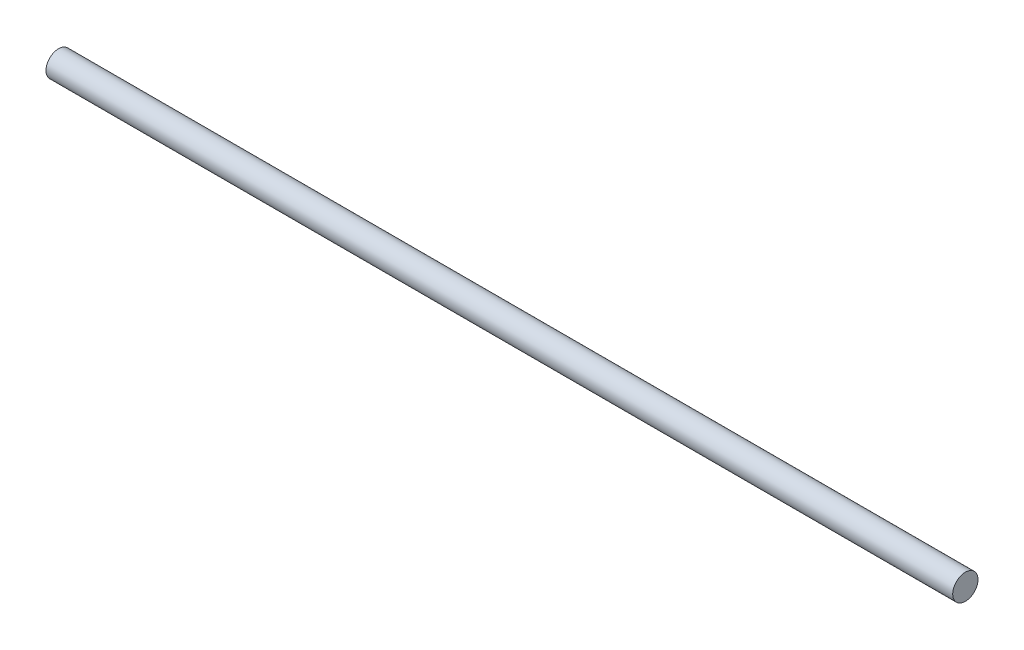
ISO-10303-21;
HEADER;
FILE_DESCRIPTION(('STEP AP214'),'2;1');
FILE_NAME('part.step','',(''),(''),'','','');
FILE_SCHEMA(('AUTOMOTIVE_DESIGN { 1 0 10303 214 1 1 1 1 }'));
ENDSEC;
DATA;
#1=APPLICATION_CONTEXT('core data for automotive mechanical design processes');
#2=APPLICATION_PROTOCOL_DEFINITION('international standard','automotive_design',2000,#1);
#3=PRODUCT_CONTEXT('',#1,'mechanical');
#4=PRODUCT('Part','Part','',(#3));
#5=PRODUCT_RELATED_PRODUCT_CATEGORY('part','',(#4));
#6=PRODUCT_DEFINITION_FORMATION('','',#4);
#7=PRODUCT_DEFINITION_CONTEXT('part definition',#1,'design');
#8=PRODUCT_DEFINITION('design','',#6,#7);
#9=PRODUCT_DEFINITION_SHAPE('','',#8);
#10=(LENGTH_UNIT() NAMED_UNIT(*) SI_UNIT(.MILLI.,.METRE.));
#11=(NAMED_UNIT(*) PLANE_ANGLE_UNIT() SI_UNIT($,.RADIAN.));
#12=(NAMED_UNIT(*) SI_UNIT($,.STERADIAN.) SOLID_ANGLE_UNIT());
#13=UNCERTAINTY_MEASURE_WITH_UNIT(LENGTH_MEASURE(1.E-05),#10,'distance_accuracy_value','');
#14=(GEOMETRIC_REPRESENTATION_CONTEXT(3) GLOBAL_UNCERTAINTY_ASSIGNED_CONTEXT((#13)) GLOBAL_UNIT_ASSIGNED_CONTEXT((#10,
#11,#12)) REPRESENTATION_CONTEXT('',''));
#15=CARTESIAN_POINT('',(0.,0.,0.));
#16=DIRECTION('',(0.,0.,1.));
#17=DIRECTION('',(1.,0.,0.));
#18=AXIS2_PLACEMENT_3D('',#15,#16,#17);
#19=CARTESIAN_POINT('',(-26.,0.,0.));
#20=DIRECTION('',(1.,0.,0.));
#21=DIRECTION('',(0.,0.,-1.));
#22=AXIS2_PLACEMENT_3D('',#19,#20,#21);
#23=CYLINDRICAL_SURFACE('',#22,0.725);
#24=CARTESIAN_POINT('',(-26.,0.,0.));
#25=DIRECTION('',(1.,0.,0.));
#26=DIRECTION('',(0.,0.,-1.));
#27=AXIS2_PLACEMENT_3D('',#24,#25,#26);
#28=CIRCLE('',#27,0.725);
#29=CARTESIAN_POINT('',(-26.,0.,-0.725));
#30=VERTEX_POINT('',#29);
#31=EDGE_CURVE('E10',#30,#30,#28,.T.);
#32=CARTESIAN_POINT('',(26.,0.,0.));
#33=DIRECTION('',(1.,0.,0.));
#34=DIRECTION('',(0.,0.,-1.));
#35=AXIS2_PLACEMENT_3D('',#32,#33,#34);
#36=CIRCLE('',#35,0.725);
#37=CARTESIAN_POINT('',(26.,0.,-0.725));
#38=VERTEX_POINT('',#37);
#39=EDGE_CURVE('E37',#38,#38,#36,.T.);
#40=CARTESIAN_POINT('',(-26.,0.,-0.725));
#41=CARTESIAN_POINT('',(-25.4583333333333,0.,-0.725));
#42=CARTESIAN_POINT('',(-24.9166666666667,0.,-0.725));
#43=CARTESIAN_POINT('',(-23.8333333333333,0.,-0.725));
#44=CARTESIAN_POINT('',(-23.2916666666667,0.,-0.725));
#45=CARTESIAN_POINT('',(-22.2083333333333,0.,-0.725));
#46=CARTESIAN_POINT('',(-21.6666666666667,0.,-0.725));
#47=CARTESIAN_POINT('',(-20.5833333333333,0.,-0.725));
#48=CARTESIAN_POINT('',(-20.0416666666667,0.,-0.725));
#49=CARTESIAN_POINT('',(-18.9583333333333,0.,-0.725));
#50=CARTESIAN_POINT('',(-18.4166666666667,0.,-0.725));
#51=CARTESIAN_POINT('',(-17.3333333333333,0.,-0.725));
#52=CARTESIAN_POINT('',(-16.7916666666667,0.,-0.725));
#53=CARTESIAN_POINT('',(-15.7083333333333,0.,-0.725));
#54=CARTESIAN_POINT('',(-15.1666666666667,0.,-0.725));
#55=CARTESIAN_POINT('',(-14.0833333333333,0.,-0.725));
#56=CARTESIAN_POINT('',(-13.5416666666667,0.,-0.725));
#57=CARTESIAN_POINT('',(-12.4583333333333,0.,-0.725));
#58=CARTESIAN_POINT('',(-11.9166666666667,0.,-0.725));
#59=CARTESIAN_POINT('',(-10.8333333333333,0.,-0.725));
#60=CARTESIAN_POINT('',(-10.2916666666667,0.,-0.725));
#61=CARTESIAN_POINT('',(-9.20833333333333,0.,-0.725));
#62=CARTESIAN_POINT('',(-8.66666666666667,0.,-0.725));
#63=CARTESIAN_POINT('',(-7.58333333333333,0.,-0.725));
#64=CARTESIAN_POINT('',(-7.04166666666667,0.,-0.725));
#65=CARTESIAN_POINT('',(-5.95833333333333,0.,-0.725));
#66=CARTESIAN_POINT('',(-5.41666666666667,0.,-0.725));
#67=CARTESIAN_POINT('',(-4.33333333333333,0.,-0.725));
#68=CARTESIAN_POINT('',(-3.79166666666667,0.,-0.725));
#69=CARTESIAN_POINT('',(-2.70833333333333,0.,-0.725));
#70=CARTESIAN_POINT('',(-2.16666666666667,0.,-0.725));
#71=CARTESIAN_POINT('',(-1.08333333333333,0.,-0.725));
#72=CARTESIAN_POINT('',(-0.541666666666667,0.,-0.725));
#73=CARTESIAN_POINT('',(0.541666666666667,0.,-0.725));
#74=CARTESIAN_POINT('',(1.08333333333333,0.,-0.725));
#75=CARTESIAN_POINT('',(2.16666666666667,0.,-0.725));
#76=CARTESIAN_POINT('',(2.70833333333333,0.,-0.725));
#77=CARTESIAN_POINT('',(3.79166666666667,0.,-0.725));
#78=CARTESIAN_POINT('',(4.33333333333333,0.,-0.725));
#79=CARTESIAN_POINT('',(5.41666666666667,0.,-0.725));
#80=CARTESIAN_POINT('',(5.95833333333333,0.,-0.725));
#81=CARTESIAN_POINT('',(7.04166666666666,0.,-0.725));
#82=CARTESIAN_POINT('',(7.58333333333333,0.,-0.725));
#83=CARTESIAN_POINT('',(8.66666666666666,0.,-0.725));
#84=CARTESIAN_POINT('',(9.20833333333333,0.,-0.725));
#85=CARTESIAN_POINT('',(10.2916666666667,0.,-0.725));
#86=CARTESIAN_POINT('',(10.8333333333333,0.,-0.725));
#87=CARTESIAN_POINT('',(11.9166666666667,0.,-0.725));
#88=CARTESIAN_POINT('',(12.4583333333333,0.,-0.725));
#89=CARTESIAN_POINT('',(13.5416666666667,0.,-0.725));
#90=CARTESIAN_POINT('',(14.0833333333333,0.,-0.725));
#91=CARTESIAN_POINT('',(15.1666666666667,0.,-0.725));
#92=CARTESIAN_POINT('',(15.7083333333333,0.,-0.725));
#93=CARTESIAN_POINT('',(16.7916666666667,0.,-0.725));
#94=CARTESIAN_POINT('',(17.3333333333333,0.,-0.725));
#95=CARTESIAN_POINT('',(18.4166666666667,0.,-0.725));
#96=CARTESIAN_POINT('',(18.9583333333333,0.,-0.725));
#97=CARTESIAN_POINT('',(20.0416666666667,0.,-0.725));
#98=CARTESIAN_POINT('',(20.5833333333333,0.,-0.725));
#99=CARTESIAN_POINT('',(21.6666666666667,0.,-0.725));
#100=CARTESIAN_POINT('',(22.2083333333333,0.,-0.725));
#101=CARTESIAN_POINT('',(23.2916666666667,0.,-0.725));
#102=CARTESIAN_POINT('',(23.8333333333333,0.,-0.725));
#103=CARTESIAN_POINT('',(24.9166666666667,0.,-0.725));
#104=CARTESIAN_POINT('',(25.4583333333333,0.,-0.725));
#105=CARTESIAN_POINT('',(26.,0.,-0.725));
#106=B_SPLINE_CURVE_WITH_KNOTS('',3,(#40,#41,#42,#43,#44,#45,#46,#47,#48,#49,#50,#51,#52,#53,
#54,#55,#56,#57,#58,#59,#60,#61,#62,#63,#64,#65,#66,#67,#68,#69,#70,#71,#72,#73,#74,#75,#76,#77,
#78,#79,#80,#81,#82,#83,#84,#85,#86,#87,#88,#89,#90,#91,#92,#93,#94,#95,#96,#97,#98,#99,#100,
#101,#102,#103,#104,#105),.UNSPECIFIED.,.F.,.F.,(4,2,2,2,2,2,2,2,2,2,2,2,2,2,2,2,2,2,2,2,2,2,2,
2,2,2,2,2,2,2,2,2,4),(0.,1.625,3.25,4.875,6.5,8.125,9.75,11.375,13.,14.625,16.25,17.875,19.5,
21.125,22.75,24.375,26.,27.625,29.25,30.875,32.5,34.125,35.75,37.375,39.,40.625,42.25,43.875,
45.5,47.125,48.75,50.375,52.),.UNSPECIFIED.);
#107=EDGE_CURVE('BSEAM31',#30,#38,#106,.T.);
#108=ORIENTED_EDGE('',*,*,#31,.T.);
#109=ORIENTED_EDGE('',*,*,#39,.F.);
#110=ORIENTED_EDGE('',*,*,#107,.T.);
#111=ORIENTED_EDGE('',*,*,#107,.F.);
#112=EDGE_LOOP('',(#108,#110,#109,#111));
#113=FACE_BOUND('',#112,.T.);
#114=ADVANCED_FACE('F31',(#113),#23,.T.);
#115=CARTESIAN_POINT('',(-26.,0.,0.));
#116=DIRECTION('',(1.,0.,0.));
#117=DIRECTION('',(0.,0.,-1.));
#118=AXIS2_PLACEMENT_3D('',#115,#116,#117);
#119=PLANE('',#118);
#120=ORIENTED_EDGE('',*,*,#31,.F.);
#121=EDGE_LOOP('',(#120));
#122=FACE_BOUND('',#121,.T.);
#123=ADVANCED_FACE('F46',(#122),#119,.F.);
#124=CARTESIAN_POINT('',(26.,0.,0.));
#125=DIRECTION('',(1.,0.,0.));
#126=DIRECTION('',(0.,0.,-1.));
#127=AXIS2_PLACEMENT_3D('',#124,#125,#126);
#128=PLANE('',#127);
#129=ORIENTED_EDGE('',*,*,#39,.T.);
#130=EDGE_LOOP('',(#129));
#131=FACE_BOUND('',#130,.T.);
#132=ADVANCED_FACE('F43',(#131),#128,.T.);
#133=CLOSED_SHELL('',(#114,#123,#132));
#134=MANIFOLD_SOLID_BREP('B2',#133);
#135=ADVANCED_BREP_SHAPE_REPRESENTATION('',(#18,#134),#14);
#136=SHAPE_DEFINITION_REPRESENTATION(#9,#135);
ENDSEC;
END-ISO-10303-21;
